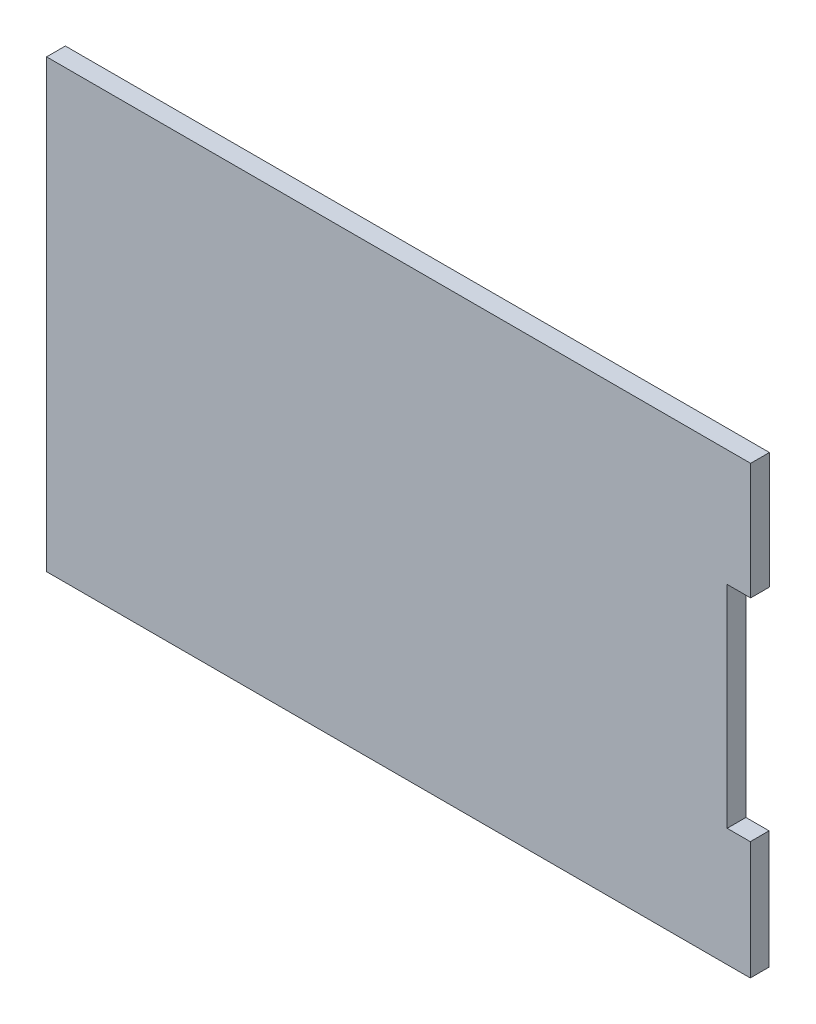
ISO-10303-21;
HEADER;
FILE_DESCRIPTION(('STEP AP214'),'2;1');
FILE_NAME('part.step','',(''),(''),'','','');
FILE_SCHEMA(('AUTOMOTIVE_DESIGN { 1 0 10303 214 1 1 1 1 }'));
ENDSEC;
DATA;
#1=APPLICATION_CONTEXT('core data for automotive mechanical design processes');
#2=APPLICATION_PROTOCOL_DEFINITION('international standard','automotive_design',2000,#1);
#3=PRODUCT_CONTEXT('',#1,'mechanical');
#4=PRODUCT('Part','Part','',(#3));
#5=PRODUCT_RELATED_PRODUCT_CATEGORY('part','',(#4));
#6=PRODUCT_DEFINITION_FORMATION('','',#4);
#7=PRODUCT_DEFINITION_CONTEXT('part definition',#1,'design');
#8=PRODUCT_DEFINITION('design','',#6,#7);
#9=PRODUCT_DEFINITION_SHAPE('','',#8);
#10=(LENGTH_UNIT() NAMED_UNIT(*) SI_UNIT(.MILLI.,.METRE.));
#11=(NAMED_UNIT(*) PLANE_ANGLE_UNIT() SI_UNIT($,.RADIAN.));
#12=(NAMED_UNIT(*) SI_UNIT($,.STERADIAN.) SOLID_ANGLE_UNIT());
#13=UNCERTAINTY_MEASURE_WITH_UNIT(LENGTH_MEASURE(1.E-05),#10,'distance_accuracy_value','');
#14=(GEOMETRIC_REPRESENTATION_CONTEXT(3) GLOBAL_UNCERTAINTY_ASSIGNED_CONTEXT((#13)) GLOBAL_UNIT_ASSIGNED_CONTEXT((#10,
#11,#12)) REPRESENTATION_CONTEXT('',''));
#15=CARTESIAN_POINT('',(0.,0.,0.));
#16=DIRECTION('',(0.,0.,1.));
#17=DIRECTION('',(1.,0.,0.));
#18=AXIS2_PLACEMENT_3D('',#15,#16,#17);
#19=CARTESIAN_POINT('',(0.,0.,0.3));
#20=DIRECTION('',(0.,0.,1.));
#21=DIRECTION('',(1.,0.,0.));
#22=AXIS2_PLACEMENT_3D('',#19,#20,#21);
#23=PLANE('',#22);
#24=DIRECTION('',(0.,1.,0.));
#25=VECTOR('',#24,1.);
#26=CARTESIAN_POINT('',(-28.45,3.00477991377225,0.3));
#27=LINE('',#26,#25);
#28=CARTESIAN_POINT('',(-28.45,-2.99522008622775,0.3));
#29=VERTEX_POINT('',#28);
#30=CARTESIAN_POINT('',(-28.45,3.00477991377225,0.3));
#31=VERTEX_POINT('',#30);
#32=EDGE_CURVE('E241',#29,#31,#27,.T.);
#33=ORIENTED_EDGE('',*,*,#32,.F.);
#34=DIRECTION('',(-1.,0.,0.));
#35=VECTOR('',#34,1.);
#36=CARTESIAN_POINT('',(-22.45,-2.99522008622775,0.3));
#37=LINE('',#36,#35);
#38=CARTESIAN_POINT('',(-22.45,-2.99522008622775,0.3));
#39=VERTEX_POINT('',#38);
#40=EDGE_CURVE('E235',#39,#29,#37,.T.);
#41=ORIENTED_EDGE('',*,*,#40,.F.);
#42=DIRECTION('',(0.,-1.,0.));
#43=VECTOR('',#42,1.);
#44=CARTESIAN_POINT('',(-22.45,3.00477991377225,0.3));
#45=LINE('',#44,#43);
#46=CARTESIAN_POINT('',(-22.45,3.00477991377225,0.3));
#47=VERTEX_POINT('',#46);
#48=EDGE_CURVE('E237',#47,#39,#45,.T.);
#49=ORIENTED_EDGE('',*,*,#48,.F.);
#50=DIRECTION('',(1.,0.,0.));
#51=VECTOR('',#50,1.);
#52=CARTESIAN_POINT('',(-22.45,3.00477991377225,0.3));
#53=LINE('',#52,#51);
#54=EDGE_CURVE('E238',#31,#47,#53,.T.);
#55=ORIENTED_EDGE('',*,*,#54,.F.);
#56=EDGE_LOOP('',(#33,#41,#49,#55));
#57=FACE_BOUND('',#56,.T.);
#58=DIRECTION('',(-1.,0.,0.));
#59=VECTOR('',#58,1.);
#60=CARTESIAN_POINT('',(-36.45,19.0047679580177,0.3));
#61=LINE('',#60,#59);
#62=CARTESIAN_POINT('',(23.55,19.0047679580177,0.3));
#63=VERTEX_POINT('',#62);
#64=CARTESIAN_POINT('',(-36.45,19.0047679580177,0.3));
#65=VERTEX_POINT('',#64);
#66=EDGE_CURVE('E209',#63,#65,#61,.T.);
#67=ORIENTED_EDGE('',*,*,#66,.F.);
#68=DIRECTION('',(0.,1.,0.));
#69=VECTOR('',#68,1.);
#70=CARTESIAN_POINT('',(23.55,9.06833811111835,0.3));
#71=LINE('',#70,#69);
#72=CARTESIAN_POINT('',(23.55,9.06833811111835,0.3));
#73=VERTEX_POINT('',#72);
#74=EDGE_CURVE('E288',#73,#63,#71,.T.);
#75=ORIENTED_EDGE('',*,*,#74,.F.);
#76=DIRECTION('',(1.,0.,0.));
#77=VECTOR('',#76,1.);
#78=CARTESIAN_POINT('',(23.55,9.06833811111835,0.3));
#79=LINE('',#78,#77);
#80=CARTESIAN_POINT('',(21.55,9.06833811111835,0.3));
#81=VERTEX_POINT('',#80);
#82=EDGE_CURVE('E311',#81,#73,#79,.T.);
#83=ORIENTED_EDGE('',*,*,#82,.F.);
#84=DIRECTION('',(0.,1.,0.));
#85=VECTOR('',#84,1.);
#86=CARTESIAN_POINT('',(21.55,9.06833811111835,0.3));
#87=LINE('',#86,#85);
#88=CARTESIAN_POINT('',(21.55,-8.93166188888165,0.3));
#89=VERTEX_POINT('',#88);
#90=EDGE_CURVE('E313',#89,#81,#87,.T.);
#91=ORIENTED_EDGE('',*,*,#90,.F.);
#92=DIRECTION('',(-1.,0.,0.));
#93=VECTOR('',#92,1.);
#94=CARTESIAN_POINT('',(23.5198563903194,-8.93166188888165,0.3));
#95=LINE('',#94,#93);
#96=CARTESIAN_POINT('',(23.5198563903194,-8.93166188888165,0.3));
#97=VERTEX_POINT('',#96);
#98=EDGE_CURVE('E310',#97,#89,#95,.T.);
#99=ORIENTED_EDGE('',*,*,#98,.F.);
#100=DIRECTION('',(0.,1.,0.));
#101=VECTOR('',#100,1.);
#102=CARTESIAN_POINT('',(23.5198563903194,-8.93166188888165,0.3));
#103=LINE('',#102,#101);
#104=CARTESIAN_POINT('',(23.5198563903194,-18.9952200862277,0.3));
#105=VERTEX_POINT('',#104);
#106=EDGE_CURVE('E307',#105,#97,#103,.T.);
#107=ORIENTED_EDGE('',*,*,#106,.F.);
#108=DIRECTION('',(1.,0.,0.));
#109=VECTOR('',#108,1.);
#110=CARTESIAN_POINT('',(-36.45,-18.9952200862277,0.3));
#111=LINE('',#110,#109);
#112=CARTESIAN_POINT('',(-36.45,-18.9952200862277,0.3));
#113=VERTEX_POINT('',#112);
#114=EDGE_CURVE('E302',#113,#105,#111,.T.);
#115=ORIENTED_EDGE('',*,*,#114,.F.);
#116=DIRECTION('',(0.,-1.,0.));
#117=VECTOR('',#116,1.);
#118=CARTESIAN_POINT('',(-36.45,-18.9952200862277,0.3));
#119=LINE('',#118,#117);
#120=EDGE_CURVE('E213',#65,#113,#119,.T.);
#121=ORIENTED_EDGE('',*,*,#120,.F.);
#122=EDGE_LOOP('',(#67,#75,#83,#91,#99,#107,#115,#121));
#123=FACE_BOUND('',#122,.T.);
#124=DIRECTION('',(0.,1.,0.));
#125=VECTOR('',#124,1.);
#126=CARTESIAN_POINT('',(-28.45,-7.49522008622774,0.3));
#127=LINE('',#126,#125);
#128=CARTESIAN_POINT('',(-28.45,-13.4952200862277,0.3));
#129=VERTEX_POINT('',#128);
#130=CARTESIAN_POINT('',(-28.45,-7.49522008622774,0.3));
#131=VERTEX_POINT('',#130);
#132=EDGE_CURVE('E224',#129,#131,#127,.T.);
#133=ORIENTED_EDGE('',*,*,#132,.F.);
#134=DIRECTION('',(-1.,0.,0.));
#135=VECTOR('',#134,1.);
#136=CARTESIAN_POINT('',(-22.45,-13.4952200862277,0.3));
#137=LINE('',#136,#135);
#138=CARTESIAN_POINT('',(-22.45,-13.4952200862277,0.3));
#139=VERTEX_POINT('',#138);
#140=EDGE_CURVE('E266',#139,#129,#137,.T.);
#141=ORIENTED_EDGE('',*,*,#140,.F.);
#142=DIRECTION('',(0.,-1.,0.));
#143=VECTOR('',#142,1.);
#144=CARTESIAN_POINT('',(-22.45,-7.49522008622774,0.3));
#145=LINE('',#144,#143);
#146=CARTESIAN_POINT('',(-22.45,-7.49522008622774,0.3));
#147=VERTEX_POINT('',#146);
#148=EDGE_CURVE('E267',#147,#139,#145,.T.);
#149=ORIENTED_EDGE('',*,*,#148,.F.);
#150=DIRECTION('',(1.,0.,0.));
#151=VECTOR('',#150,1.);
#152=CARTESIAN_POINT('',(-22.45,-7.49522008622774,0.3));
#153=LINE('',#152,#151);
#154=EDGE_CURVE('E272',#131,#147,#153,.T.);
#155=ORIENTED_EDGE('',*,*,#154,.F.);
#156=EDGE_LOOP('',(#133,#141,#149,#155));
#157=FACE_BOUND('',#156,.T.);
#158=DIRECTION('',(0.,1.,0.));
#159=VECTOR('',#158,1.);
#160=CARTESIAN_POINT('',(-28.45,13.5047679580177,0.3));
#161=LINE('',#160,#159);
#162=CARTESIAN_POINT('',(-28.45,7.50476795801769,0.3));
#163=VERTEX_POINT('',#162);
#164=CARTESIAN_POINT('',(-28.45,13.5047679580177,0.3));
#165=VERTEX_POINT('',#164);
#166=EDGE_CURVE('E70',#163,#165,#161,.T.);
#167=ORIENTED_EDGE('',*,*,#166,.F.);
#168=DIRECTION('',(-1.,0.,0.));
#169=VECTOR('',#168,1.);
#170=CARTESIAN_POINT('',(-22.45,7.50476795801769,0.3));
#171=LINE('',#170,#169);
#172=CARTESIAN_POINT('',(-22.45,7.50476795801769,0.3));
#173=VERTEX_POINT('',#172);
#174=EDGE_CURVE('E75',#173,#163,#171,.T.);
#175=ORIENTED_EDGE('',*,*,#174,.F.);
#176=DIRECTION('',(0.,-1.,0.));
#177=VECTOR('',#176,1.);
#178=CARTESIAN_POINT('',(-22.45,13.5047679580177,0.3));
#179=LINE('',#178,#177);
#180=CARTESIAN_POINT('',(-22.45,13.5047679580177,0.3));
#181=VERTEX_POINT('',#180);
#182=EDGE_CURVE('E617',#181,#173,#179,.T.);
#183=ORIENTED_EDGE('',*,*,#182,.F.);
#184=DIRECTION('',(1.,0.,0.));
#185=VECTOR('',#184,1.);
#186=CARTESIAN_POINT('',(-22.45,13.5047679580177,0.3));
#187=LINE('',#186,#185);
#188=EDGE_CURVE('E628',#165,#181,#187,.T.);
#189=ORIENTED_EDGE('',*,*,#188,.F.);
#190=EDGE_LOOP('',(#167,#175,#183,#189));
#191=FACE_BOUND('',#190,.T.);
#192=ADVANCED_FACE('F52',(#57,#123,#157,#191),#23,.F.);
#193=CARTESIAN_POINT('',(-36.45,19.0047679580177,1.9));
#194=DIRECTION('',(0.,-1.,0.));
#195=DIRECTION('',(1.,0.,0.));
#196=AXIS2_PLACEMENT_3D('',#193,#194,#195);
#197=PLANE('',#196);
#198=ORIENTED_EDGE('',*,*,#66,.T.);
#199=DIRECTION('',(0.,0.,-1.));
#200=VECTOR('',#199,1.);
#201=CARTESIAN_POINT('',(-36.45,19.0047679580177,1.9));
#202=LINE('',#201,#200);
#203=CARTESIAN_POINT('',(-36.45,19.0047679580177,1.9));
#204=VERTEX_POINT('',#203);
#205=EDGE_CURVE('E12',#204,#65,#202,.T.);
#206=ORIENTED_EDGE('',*,*,#205,.F.);
#207=DIRECTION('',(-1.,0.,0.));
#208=VECTOR('',#207,1.);
#209=CARTESIAN_POINT('',(-36.45,19.0047679580177,1.9));
#210=LINE('',#209,#208);
#211=CARTESIAN_POINT('',(23.55,19.0047679580177,1.9));
#212=VERTEX_POINT('',#211);
#213=EDGE_CURVE('E282',#212,#204,#210,.T.);
#214=ORIENTED_EDGE('',*,*,#213,.F.);
#215=DIRECTION('',(0.,0.,-1.));
#216=VECTOR('',#215,1.);
#217=CARTESIAN_POINT('',(23.55,19.0047679580177,1.9));
#218=LINE('',#217,#216);
#219=EDGE_CURVE('E301',#212,#63,#218,.T.);
#220=ORIENTED_EDGE('',*,*,#219,.T.);
#221=EDGE_LOOP('',(#198,#206,#214,#220));
#222=FACE_BOUND('',#221,.T.);
#223=ADVANCED_FACE('F54',(#222),#197,.F.);
#224=CARTESIAN_POINT('',(-36.45,-18.9952200862277,1.9));
#225=DIRECTION('',(1.,0.,0.));
#226=DIRECTION('',(0.,1.,0.));
#227=AXIS2_PLACEMENT_3D('',#224,#225,#226);
#228=PLANE('',#227);
#229=ORIENTED_EDGE('',*,*,#120,.T.);
#230=DIRECTION('',(0.,0.,-1.));
#231=VECTOR('',#230,1.);
#232=CARTESIAN_POINT('',(-36.45,-18.9952200862277,1.9));
#233=LINE('',#232,#231);
#234=CARTESIAN_POINT('',(-36.45,-18.9952200862277,1.9));
#235=VERTEX_POINT('',#234);
#236=EDGE_CURVE('E63',#235,#113,#233,.T.);
#237=ORIENTED_EDGE('',*,*,#236,.F.);
#238=DIRECTION('',(0.,-1.,0.));
#239=VECTOR('',#238,1.);
#240=CARTESIAN_POINT('',(-36.45,-18.9952200862277,1.9));
#241=LINE('',#240,#239);
#242=EDGE_CURVE('E290',#204,#235,#241,.T.);
#243=ORIENTED_EDGE('',*,*,#242,.F.);
#244=ORIENTED_EDGE('',*,*,#205,.T.);
#245=EDGE_LOOP('',(#229,#237,#243,#244));
#246=FACE_BOUND('',#245,.T.);
#247=ADVANCED_FACE('F357',(#246),#228,.F.);
#248=CARTESIAN_POINT('',(-36.45,-18.9952200862277,1.9));
#249=DIRECTION('',(0.,1.,0.));
#250=DIRECTION('',(-1.,0.,0.));
#251=AXIS2_PLACEMENT_3D('',#248,#249,#250);
#252=PLANE('',#251);
#253=ORIENTED_EDGE('',*,*,#114,.T.);
#254=DIRECTION('',(0.,0.,-1.));
#255=VECTOR('',#254,1.);
#256=CARTESIAN_POINT('',(23.5198563903194,-18.9952200862277,1.9));
#257=LINE('',#256,#255);
#258=CARTESIAN_POINT('',(23.5198563903194,-18.9952200862277,1.9));
#259=VERTEX_POINT('',#258);
#260=EDGE_CURVE('E329',#259,#105,#257,.T.);
#261=ORIENTED_EDGE('',*,*,#260,.F.);
#262=DIRECTION('',(1.,0.,0.));
#263=VECTOR('',#262,1.);
#264=CARTESIAN_POINT('',(-36.45,-18.9952200862277,1.9));
#265=LINE('',#264,#263);
#266=EDGE_CURVE('E292',#235,#259,#265,.T.);
#267=ORIENTED_EDGE('',*,*,#266,.F.);
#268=ORIENTED_EDGE('',*,*,#236,.T.);
#269=EDGE_LOOP('',(#253,#261,#267,#268));
#270=FACE_BOUND('',#269,.T.);
#271=ADVANCED_FACE('F340',(#270),#252,.F.);
#272=CARTESIAN_POINT('',(23.5198563903194,-8.93166188888165,1.9));
#273=DIRECTION('',(-1.,0.,0.));
#274=DIRECTION('',(0.,-1.,0.));
#275=AXIS2_PLACEMENT_3D('',#272,#273,#274);
#276=PLANE('',#275);
#277=ORIENTED_EDGE('',*,*,#106,.T.);
#278=DIRECTION('',(0.,0.,-1.));
#279=VECTOR('',#278,1.);
#280=CARTESIAN_POINT('',(23.5198563903194,-8.93166188888165,1.9));
#281=LINE('',#280,#279);
#282=CARTESIAN_POINT('',(23.5198563903194,-8.93166188888165,1.9));
#283=VERTEX_POINT('',#282);
#284=EDGE_CURVE('E330',#283,#97,#281,.T.);
#285=ORIENTED_EDGE('',*,*,#284,.F.);
#286=DIRECTION('',(0.,1.,0.));
#287=VECTOR('',#286,1.);
#288=CARTESIAN_POINT('',(23.5198563903194,-8.93166188888165,1.9));
#289=LINE('',#288,#287);
#290=EDGE_CURVE('E291',#259,#283,#289,.T.);
#291=ORIENTED_EDGE('',*,*,#290,.F.);
#292=ORIENTED_EDGE('',*,*,#260,.T.);
#293=EDGE_LOOP('',(#277,#285,#291,#292));
#294=FACE_BOUND('',#293,.T.);
#295=ADVANCED_FACE('F346',(#294),#276,.F.);
#296=CARTESIAN_POINT('',(23.5198563903194,-8.93166188888165,1.9));
#297=DIRECTION('',(0.,-1.,0.));
#298=DIRECTION('',(1.,0.,0.));
#299=AXIS2_PLACEMENT_3D('',#296,#297,#298);
#300=PLANE('',#299);
#301=ORIENTED_EDGE('',*,*,#98,.T.);
#302=DIRECTION('',(0.,0.,-1.));
#303=VECTOR('',#302,1.);
#304=CARTESIAN_POINT('',(21.55,-8.93166188888165,1.9));
#305=LINE('',#304,#303);
#306=CARTESIAN_POINT('',(21.55,-8.93166188888165,1.9));
#307=VERTEX_POINT('',#306);
#308=EDGE_CURVE('E322',#307,#89,#305,.T.);
#309=ORIENTED_EDGE('',*,*,#308,.F.);
#310=DIRECTION('',(-1.,0.,0.));
#311=VECTOR('',#310,1.);
#312=CARTESIAN_POINT('',(23.5198563903194,-8.93166188888165,1.9));
#313=LINE('',#312,#311);
#314=EDGE_CURVE('E293',#283,#307,#313,.T.);
#315=ORIENTED_EDGE('',*,*,#314,.F.);
#316=ORIENTED_EDGE('',*,*,#284,.T.);
#317=EDGE_LOOP('',(#301,#309,#315,#316));
#318=FACE_BOUND('',#317,.T.);
#319=ADVANCED_FACE('F355',(#318),#300,.F.);
#320=CARTESIAN_POINT('',(21.55,9.06833811111835,1.9));
#321=DIRECTION('',(-1.,0.,0.));
#322=DIRECTION('',(0.,-1.,0.));
#323=AXIS2_PLACEMENT_3D('',#320,#321,#322);
#324=PLANE('',#323);
#325=ORIENTED_EDGE('',*,*,#90,.T.);
#326=DIRECTION('',(0.,0.,-1.));
#327=VECTOR('',#326,1.);
#328=CARTESIAN_POINT('',(21.55,9.06833811111835,1.9));
#329=LINE('',#328,#327);
#330=CARTESIAN_POINT('',(21.55,9.06833811111835,1.9));
#331=VERTEX_POINT('',#330);
#332=EDGE_CURVE('E321',#331,#81,#329,.T.);
#333=ORIENTED_EDGE('',*,*,#332,.F.);
#334=DIRECTION('',(0.,1.,0.));
#335=VECTOR('',#334,1.);
#336=CARTESIAN_POINT('',(21.55,9.06833811111835,1.9));
#337=LINE('',#336,#335);
#338=EDGE_CURVE('E300',#307,#331,#337,.T.);
#339=ORIENTED_EDGE('',*,*,#338,.F.);
#340=ORIENTED_EDGE('',*,*,#308,.T.);
#341=EDGE_LOOP('',(#325,#333,#339,#340));
#342=FACE_BOUND('',#341,.T.);
#343=ADVANCED_FACE('F373',(#342),#324,.F.);
#344=CARTESIAN_POINT('',(23.55,9.06833811111835,1.9));
#345=DIRECTION('',(0.,1.,0.));
#346=DIRECTION('',(0.,0.,1.));
#347=AXIS2_PLACEMENT_3D('',#344,#345,#346);
#348=PLANE('',#347);
#349=ORIENTED_EDGE('',*,*,#82,.T.);
#350=DIRECTION('',(0.,0.,-1.));
#351=VECTOR('',#350,1.);
#352=CARTESIAN_POINT('',(23.55,9.06833811111835,1.9));
#353=LINE('',#352,#351);
#354=CARTESIAN_POINT('',(23.55,9.06833811111835,1.9));
#355=VERTEX_POINT('',#354);
#356=EDGE_CURVE('E318',#355,#73,#353,.T.);
#357=ORIENTED_EDGE('',*,*,#356,.F.);
#358=DIRECTION('',(1.,0.,0.));
#359=VECTOR('',#358,1.);
#360=CARTESIAN_POINT('',(23.55,9.06833811111835,1.9));
#361=LINE('',#360,#359);
#362=EDGE_CURVE('E299',#331,#355,#361,.T.);
#363=ORIENTED_EDGE('',*,*,#362,.F.);
#364=ORIENTED_EDGE('',*,*,#332,.T.);
#365=EDGE_LOOP('',(#349,#357,#363,#364));
#366=FACE_BOUND('',#365,.T.);
#367=ADVANCED_FACE('F371',(#366),#348,.F.);
#368=CARTESIAN_POINT('',(23.55,9.06833811111835,1.9));
#369=DIRECTION('',(-1.,0.,0.));
#370=DIRECTION('',(0.,-1.,0.));
#371=AXIS2_PLACEMENT_3D('',#368,#369,#370);
#372=PLANE('',#371);
#373=ORIENTED_EDGE('',*,*,#74,.T.);
#374=ORIENTED_EDGE('',*,*,#219,.F.);
#375=DIRECTION('',(0.,1.,0.));
#376=VECTOR('',#375,1.);
#377=CARTESIAN_POINT('',(23.55,9.06833811111835,1.9));
#378=LINE('',#377,#376);
#379=EDGE_CURVE('E304',#355,#212,#378,.T.);
#380=ORIENTED_EDGE('',*,*,#379,.F.);
#381=ORIENTED_EDGE('',*,*,#356,.T.);
#382=EDGE_LOOP('',(#373,#374,#380,#381));
#383=FACE_BOUND('',#382,.T.);
#384=ADVANCED_FACE('F368',(#383),#372,.F.);
#385=CARTESIAN_POINT('',(0.,0.,1.9));
#386=DIRECTION('',(0.,0.,1.));
#387=DIRECTION('',(1.,0.,0.));
#388=AXIS2_PLACEMENT_3D('',#385,#386,#387);
#389=PLANE('',#388);
#390=ORIENTED_EDGE('',*,*,#213,.T.);
#391=ORIENTED_EDGE('',*,*,#242,.T.);
#392=ORIENTED_EDGE('',*,*,#266,.T.);
#393=ORIENTED_EDGE('',*,*,#290,.T.);
#394=ORIENTED_EDGE('',*,*,#314,.T.);
#395=ORIENTED_EDGE('',*,*,#338,.T.);
#396=ORIENTED_EDGE('',*,*,#362,.T.);
#397=ORIENTED_EDGE('',*,*,#379,.T.);
#398=EDGE_LOOP('',(#390,#391,#392,#393,#394,#395,#396,#397));
#399=FACE_BOUND('',#398,.T.);
#400=ADVANCED_FACE('F359',(#399),#389,.T.);
#401=CARTESIAN_POINT('',(-28.45,-7.49522008622774,-4.7));
#402=DIRECTION('',(1.,0.,0.));
#403=DIRECTION('',(0.,0.,-1.));
#404=AXIS2_PLACEMENT_3D('',#401,#402,#403);
#405=PLANE('',#404);
#406=ORIENTED_EDGE('',*,*,#132,.T.);
#407=DIRECTION('',(0.,0.,1.));
#408=VECTOR('',#407,1.);
#409=CARTESIAN_POINT('',(-28.45,-7.49522008622774,-4.7));
#410=LINE('',#409,#408);
#411=CARTESIAN_POINT('',(-28.45,-7.49522008622774,-4.7));
#412=VERTEX_POINT('',#411);
#413=EDGE_CURVE('E251',#412,#131,#410,.T.);
#414=ORIENTED_EDGE('',*,*,#413,.F.);
#415=DIRECTION('',(0.,1.,0.));
#416=VECTOR('',#415,1.);
#417=CARTESIAN_POINT('',(-28.45,-7.49522008622774,-4.7));
#418=LINE('',#417,#416);
#419=CARTESIAN_POINT('',(-28.45,-13.4952200862277,-4.7));
#420=VERTEX_POINT('',#419);
#421=EDGE_CURVE('E269',#420,#412,#418,.T.);
#422=ORIENTED_EDGE('',*,*,#421,.F.);
#423=DIRECTION('',(0.,0.,1.));
#424=VECTOR('',#423,1.);
#425=CARTESIAN_POINT('',(-28.45,-13.4952200862277,-4.7));
#426=LINE('',#425,#424);
#427=EDGE_CURVE('E265',#420,#129,#426,.T.);
#428=ORIENTED_EDGE('',*,*,#427,.T.);
#429=EDGE_LOOP('',(#406,#414,#422,#428));
#430=FACE_BOUND('',#429,.T.);
#431=ADVANCED_FACE('F399',(#430),#405,.F.);
#432=CARTESIAN_POINT('',(-22.45,-7.49522008622774,-4.7));
#433=DIRECTION('',(0.,-1.,0.));
#434=DIRECTION('',(1.,0.,0.));
#435=AXIS2_PLACEMENT_3D('',#432,#433,#434);
#436=PLANE('',#435);
#437=ORIENTED_EDGE('',*,*,#154,.T.);
#438=DIRECTION('',(0.,0.,1.));
#439=VECTOR('',#438,1.);
#440=CARTESIAN_POINT('',(-22.45,-7.49522008622774,-4.7));
#441=LINE('',#440,#439);
#442=CARTESIAN_POINT('',(-22.45,-7.49522008622774,-4.7));
#443=VERTEX_POINT('',#442);
#444=EDGE_CURVE('E258',#443,#147,#441,.T.);
#445=ORIENTED_EDGE('',*,*,#444,.F.);
#446=DIRECTION('',(1.,0.,0.));
#447=VECTOR('',#446,1.);
#448=CARTESIAN_POINT('',(-22.45,-7.49522008622774,-4.7));
#449=LINE('',#448,#447);
#450=EDGE_CURVE('E283',#412,#443,#449,.T.);
#451=ORIENTED_EDGE('',*,*,#450,.F.);
#452=ORIENTED_EDGE('',*,*,#413,.T.);
#453=EDGE_LOOP('',(#437,#445,#451,#452));
#454=FACE_BOUND('',#453,.T.);
#455=ADVANCED_FACE('F398',(#454),#436,.F.);
#456=CARTESIAN_POINT('',(-22.45,-7.49522008622774,-4.7));
#457=DIRECTION('',(-1.,0.,0.));
#458=DIRECTION('',(0.,0.,1.));
#459=AXIS2_PLACEMENT_3D('',#456,#457,#458);
#460=PLANE('',#459);
#461=ORIENTED_EDGE('',*,*,#148,.T.);
#462=DIRECTION('',(0.,0.,1.));
#463=VECTOR('',#462,1.);
#464=CARTESIAN_POINT('',(-22.45,-13.4952200862277,-4.7));
#465=LINE('',#464,#463);
#466=CARTESIAN_POINT('',(-22.45,-13.4952200862277,-4.7));
#467=VERTEX_POINT('',#466);
#468=EDGE_CURVE('E259',#467,#139,#465,.T.);
#469=ORIENTED_EDGE('',*,*,#468,.F.);
#470=DIRECTION('',(0.,-1.,0.));
#471=VECTOR('',#470,1.);
#472=CARTESIAN_POINT('',(-22.45,-7.49522008622774,-4.7));
#473=LINE('',#472,#471);
#474=EDGE_CURVE('E276',#443,#467,#473,.T.);
#475=ORIENTED_EDGE('',*,*,#474,.F.);
#476=ORIENTED_EDGE('',*,*,#444,.T.);
#477=EDGE_LOOP('',(#461,#469,#475,#476));
#478=FACE_BOUND('',#477,.T.);
#479=ADVANCED_FACE('F403',(#478),#460,.F.);
#480=CARTESIAN_POINT('',(-22.45,-13.4952200862277,-4.7));
#481=DIRECTION('',(0.,1.,0.));
#482=DIRECTION('',(0.,0.,1.));
#483=AXIS2_PLACEMENT_3D('',#480,#481,#482);
#484=PLANE('',#483);
#485=ORIENTED_EDGE('',*,*,#140,.T.);
#486=ORIENTED_EDGE('',*,*,#427,.F.);
#487=DIRECTION('',(-1.,0.,0.));
#488=VECTOR('',#487,1.);
#489=CARTESIAN_POINT('',(-22.45,-13.4952200862277,-4.7));
#490=LINE('',#489,#488);
#491=EDGE_CURVE('E264',#467,#420,#490,.T.);
#492=ORIENTED_EDGE('',*,*,#491,.F.);
#493=ORIENTED_EDGE('',*,*,#468,.T.);
#494=EDGE_LOOP('',(#485,#486,#492,#493));
#495=FACE_BOUND('',#494,.T.);
#496=ADVANCED_FACE('F413',(#495),#484,.F.);
#497=CARTESIAN_POINT('',(0.,0.,-4.7));
#498=DIRECTION('',(0.,0.,-1.));
#499=DIRECTION('',(-1.,0.,0.));
#500=AXIS2_PLACEMENT_3D('',#497,#498,#499);
#501=PLANE('',#500);
#502=ORIENTED_EDGE('',*,*,#421,.T.);
#503=ORIENTED_EDGE('',*,*,#450,.T.);
#504=ORIENTED_EDGE('',*,*,#474,.T.);
#505=ORIENTED_EDGE('',*,*,#491,.T.);
#506=EDGE_LOOP('',(#502,#503,#504,#505));
#507=FACE_BOUND('',#506,.T.);
#508=ADVANCED_FACE('F417',(#507),#501,.T.);
#509=CARTESIAN_POINT('',(-28.45,3.00477991377225,-4.7));
#510=DIRECTION('',(1.,0.,0.));
#511=DIRECTION('',(0.,0.,-1.));
#512=AXIS2_PLACEMENT_3D('',#509,#510,#511);
#513=PLANE('',#512);
#514=ORIENTED_EDGE('',*,*,#32,.T.);
#515=DIRECTION('',(0.,0.,1.));
#516=VECTOR('',#515,1.);
#517=CARTESIAN_POINT('',(-28.45,3.00477991377225,-4.7));
#518=LINE('',#517,#516);
#519=CARTESIAN_POINT('',(-28.45,3.00477991377225,-4.7));
#520=VERTEX_POINT('',#519);
#521=EDGE_CURVE('E218',#520,#31,#518,.T.);
#522=ORIENTED_EDGE('',*,*,#521,.F.);
#523=DIRECTION('',(0.,1.,0.));
#524=VECTOR('',#523,1.);
#525=CARTESIAN_POINT('',(-28.45,3.00477991377225,-4.7));
#526=LINE('',#525,#524);
#527=CARTESIAN_POINT('',(-28.45,-2.99522008622775,-4.7));
#528=VERTEX_POINT('',#527);
#529=EDGE_CURVE('E240',#528,#520,#526,.T.);
#530=ORIENTED_EDGE('',*,*,#529,.F.);
#531=DIRECTION('',(0.,0.,1.));
#532=VECTOR('',#531,1.);
#533=CARTESIAN_POINT('',(-28.45,-2.99522008622775,-4.7));
#534=LINE('',#533,#532);
#535=EDGE_CURVE('E229',#528,#29,#534,.T.);
#536=ORIENTED_EDGE('',*,*,#535,.T.);
#537=EDGE_LOOP('',(#514,#522,#530,#536));
#538=FACE_BOUND('',#537,.T.);
#539=ADVANCED_FACE('F419',(#538),#513,.F.);
#540=CARTESIAN_POINT('',(-22.45,3.00477991377225,-4.7));
#541=DIRECTION('',(0.,-1.,0.));
#542=DIRECTION('',(0.,0.,-1.));
#543=AXIS2_PLACEMENT_3D('',#540,#541,#542);
#544=PLANE('',#543);
#545=ORIENTED_EDGE('',*,*,#54,.T.);
#546=DIRECTION('',(0.,0.,1.));
#547=VECTOR('',#546,1.);
#548=CARTESIAN_POINT('',(-22.45,3.00477991377225,-4.7));
#549=LINE('',#548,#547);
#550=CARTESIAN_POINT('',(-22.45,3.00477991377225,-4.7));
#551=VERTEX_POINT('',#550);
#552=EDGE_CURVE('E225',#551,#47,#549,.T.);
#553=ORIENTED_EDGE('',*,*,#552,.F.);
#554=DIRECTION('',(1.,0.,0.));
#555=VECTOR('',#554,1.);
#556=CARTESIAN_POINT('',(-22.45,3.00477991377225,-4.7));
#557=LINE('',#556,#555);
#558=EDGE_CURVE('E248',#520,#551,#557,.T.);
#559=ORIENTED_EDGE('',*,*,#558,.F.);
#560=ORIENTED_EDGE('',*,*,#521,.T.);
#561=EDGE_LOOP('',(#545,#553,#559,#560));
#562=FACE_BOUND('',#561,.T.);
#563=ADVANCED_FACE('F422',(#562),#544,.F.);
#564=CARTESIAN_POINT('',(-22.45,3.00477991377225,-4.7));
#565=DIRECTION('',(-1.,0.,0.));
#566=DIRECTION('',(0.,0.,1.));
#567=AXIS2_PLACEMENT_3D('',#564,#565,#566);
#568=PLANE('',#567);
#569=ORIENTED_EDGE('',*,*,#48,.T.);
#570=DIRECTION('',(0.,0.,1.));
#571=VECTOR('',#570,1.);
#572=CARTESIAN_POINT('',(-22.45,-2.99522008622775,-4.7));
#573=LINE('',#572,#571);
#574=CARTESIAN_POINT('',(-22.45,-2.99522008622775,-4.7));
#575=VERTEX_POINT('',#574);
#576=EDGE_CURVE('E228',#575,#39,#573,.T.);
#577=ORIENTED_EDGE('',*,*,#576,.F.);
#578=DIRECTION('',(0.,-1.,0.));
#579=VECTOR('',#578,1.);
#580=CARTESIAN_POINT('',(-22.45,3.00477991377225,-4.7));
#581=LINE('',#580,#579);
#582=EDGE_CURVE('E246',#551,#575,#581,.T.);
#583=ORIENTED_EDGE('',*,*,#582,.F.);
#584=ORIENTED_EDGE('',*,*,#552,.T.);
#585=EDGE_LOOP('',(#569,#577,#583,#584));
#586=FACE_BOUND('',#585,.T.);
#587=ADVANCED_FACE('F437',(#586),#568,.F.);
#588=CARTESIAN_POINT('',(-22.45,-2.99522008622775,-4.7));
#589=DIRECTION('',(0.,1.,0.));
#590=DIRECTION('',(0.,0.,1.));
#591=AXIS2_PLACEMENT_3D('',#588,#589,#590);
#592=PLANE('',#591);
#593=ORIENTED_EDGE('',*,*,#40,.T.);
#594=ORIENTED_EDGE('',*,*,#535,.F.);
#595=DIRECTION('',(-1.,0.,0.));
#596=VECTOR('',#595,1.);
#597=CARTESIAN_POINT('',(-22.45,-2.99522008622775,-4.7));
#598=LINE('',#597,#596);
#599=EDGE_CURVE('E231',#575,#528,#598,.T.);
#600=ORIENTED_EDGE('',*,*,#599,.F.);
#601=ORIENTED_EDGE('',*,*,#576,.T.);
#602=EDGE_LOOP('',(#593,#594,#600,#601));
#603=FACE_BOUND('',#602,.T.);
#604=ADVANCED_FACE('F443',(#603),#592,.F.);
#605=CARTESIAN_POINT('',(0.,0.,-4.7));
#606=DIRECTION('',(0.,0.,-1.));
#607=DIRECTION('',(-1.,0.,0.));
#608=AXIS2_PLACEMENT_3D('',#605,#606,#607);
#609=PLANE('',#608);
#610=ORIENTED_EDGE('',*,*,#529,.T.);
#611=ORIENTED_EDGE('',*,*,#558,.T.);
#612=ORIENTED_EDGE('',*,*,#582,.T.);
#613=ORIENTED_EDGE('',*,*,#599,.T.);
#614=EDGE_LOOP('',(#610,#611,#612,#613));
#615=FACE_BOUND('',#614,.T.);
#616=ADVANCED_FACE('F409',(#615),#609,.T.);
#617=CARTESIAN_POINT('',(-28.45,13.5047679580177,-4.7));
#618=DIRECTION('',(1.,0.,0.));
#619=DIRECTION('',(0.,0.,-1.));
#620=AXIS2_PLACEMENT_3D('',#617,#618,#619);
#621=PLANE('',#620);
#622=ORIENTED_EDGE('',*,*,#166,.T.);
#623=DIRECTION('',(0.,0.,1.));
#624=VECTOR('',#623,1.);
#625=CARTESIAN_POINT('',(-28.45,13.5047679580177,-4.7));
#626=LINE('',#625,#624);
#627=CARTESIAN_POINT('',(-28.45,13.5047679580177,-4.7));
#628=VERTEX_POINT('',#627);
#629=EDGE_CURVE('E195',#628,#165,#626,.T.);
#630=ORIENTED_EDGE('',*,*,#629,.F.);
#631=DIRECTION('',(0.,1.,0.));
#632=VECTOR('',#631,1.);
#633=CARTESIAN_POINT('',(-28.45,13.5047679580177,-4.7));
#634=LINE('',#633,#632);
#635=CARTESIAN_POINT('',(-28.45,7.50476795801769,-4.7));
#636=VERTEX_POINT('',#635);
#637=EDGE_CURVE('E200',#636,#628,#634,.T.);
#638=ORIENTED_EDGE('',*,*,#637,.F.);
#639=DIRECTION('',(0.,0.,1.));
#640=VECTOR('',#639,1.);
#641=CARTESIAN_POINT('',(-28.45,7.50476795801769,-4.7));
#642=LINE('',#641,#640);
#643=EDGE_CURVE('E620',#636,#163,#642,.T.);
#644=ORIENTED_EDGE('',*,*,#643,.T.);
#645=EDGE_LOOP('',(#622,#630,#638,#644));
#646=FACE_BOUND('',#645,.T.);
#647=ADVANCED_FACE('F207',(#646),#621,.F.);
#648=CARTESIAN_POINT('',(-22.45,13.5047679580177,-4.7));
#649=DIRECTION('',(0.,-1.,0.));
#650=DIRECTION('',(0.,0.,-1.));
#651=AXIS2_PLACEMENT_3D('',#648,#649,#650);
#652=PLANE('',#651);
#653=ORIENTED_EDGE('',*,*,#188,.T.);
#654=DIRECTION('',(0.,0.,1.));
#655=VECTOR('',#654,1.);
#656=CARTESIAN_POINT('',(-22.45,13.5047679580177,-4.7));
#657=LINE('',#656,#655);
#658=CARTESIAN_POINT('',(-22.45,13.5047679580177,-4.7));
#659=VERTEX_POINT('',#658);
#660=EDGE_CURVE('E192',#659,#181,#657,.T.);
#661=ORIENTED_EDGE('',*,*,#660,.F.);
#662=DIRECTION('',(1.,0.,0.));
#663=VECTOR('',#662,1.);
#664=CARTESIAN_POINT('',(-22.45,13.5047679580177,-4.7));
#665=LINE('',#664,#663);
#666=EDGE_CURVE('E186',#628,#659,#665,.T.);
#667=ORIENTED_EDGE('',*,*,#666,.F.);
#668=ORIENTED_EDGE('',*,*,#629,.T.);
#669=EDGE_LOOP('',(#653,#661,#667,#668));
#670=FACE_BOUND('',#669,.T.);
#671=ADVANCED_FACE('F194',(#670),#652,.F.);
#672=CARTESIAN_POINT('',(-22.45,13.5047679580177,-4.7));
#673=DIRECTION('',(-1.,0.,0.));
#674=DIRECTION('',(0.,0.,1.));
#675=AXIS2_PLACEMENT_3D('',#672,#673,#674);
#676=PLANE('',#675);
#677=ORIENTED_EDGE('',*,*,#182,.T.);
#678=DIRECTION('',(0.,0.,1.));
#679=VECTOR('',#678,1.);
#680=CARTESIAN_POINT('',(-22.45,7.50476795801769,-4.7));
#681=LINE('',#680,#679);
#682=CARTESIAN_POINT('',(-22.45,7.50476795801769,-4.7));
#683=VERTEX_POINT('',#682);
#684=EDGE_CURVE('E214',#683,#173,#681,.T.);
#685=ORIENTED_EDGE('',*,*,#684,.F.);
#686=DIRECTION('',(0.,-1.,0.));
#687=VECTOR('',#686,1.);
#688=CARTESIAN_POINT('',(-22.45,13.5047679580177,-4.7));
#689=LINE('',#688,#687);
#690=EDGE_CURVE('E196',#659,#683,#689,.T.);
#691=ORIENTED_EDGE('',*,*,#690,.F.);
#692=ORIENTED_EDGE('',*,*,#660,.T.);
#693=EDGE_LOOP('',(#677,#685,#691,#692));
#694=FACE_BOUND('',#693,.T.);
#695=ADVANCED_FACE('F469',(#694),#676,.F.);
#696=CARTESIAN_POINT('',(-22.45,7.50476795801769,-4.7));
#697=DIRECTION('',(0.,1.,0.));
#698=DIRECTION('',(-1.,0.,0.));
#699=AXIS2_PLACEMENT_3D('',#696,#697,#698);
#700=PLANE('',#699);
#701=ORIENTED_EDGE('',*,*,#174,.T.);
#702=ORIENTED_EDGE('',*,*,#643,.F.);
#703=DIRECTION('',(-1.,0.,0.));
#704=VECTOR('',#703,1.);
#705=CARTESIAN_POINT('',(-22.45,7.50476795801769,-4.7));
#706=LINE('',#705,#704);
#707=EDGE_CURVE('E204',#683,#636,#706,.T.);
#708=ORIENTED_EDGE('',*,*,#707,.F.);
#709=ORIENTED_EDGE('',*,*,#684,.T.);
#710=EDGE_LOOP('',(#701,#702,#708,#709));
#711=FACE_BOUND('',#710,.T.);
#712=ADVANCED_FACE('F467',(#711),#700,.F.);
#713=CARTESIAN_POINT('',(0.,0.,-4.7));
#714=DIRECTION('',(0.,0.,-1.));
#715=DIRECTION('',(-1.,0.,0.));
#716=AXIS2_PLACEMENT_3D('',#713,#714,#715);
#717=PLANE('',#716);
#718=ORIENTED_EDGE('',*,*,#637,.T.);
#719=ORIENTED_EDGE('',*,*,#666,.T.);
#720=ORIENTED_EDGE('',*,*,#690,.T.);
#721=ORIENTED_EDGE('',*,*,#707,.T.);
#722=EDGE_LOOP('',(#718,#719,#720,#721));
#723=FACE_BOUND('',#722,.T.);
#724=ADVANCED_FACE('F205',(#723),#717,.T.);
#725=CLOSED_SHELL('',(#192,#223,#247,#271,#295,#319,#343,#367,#384,#400,#431,#455,#479,#496,
#508,#539,#563,#587,#604,#616,#647,#671,#695,#712,#724));
#726=MANIFOLD_SOLID_BREP('B2',#725);
#727=CARTESIAN_POINT('',(19.55,12.7,0.3));
#728=DIRECTION('',(-1.,0.,0.));
#729=DIRECTION('',(0.,-1.,0.));
#730=AXIS2_PLACEMENT_3D('',#727,#728,#729);
#731=PLANE('',#730);
#732=DIRECTION('',(0.,1.,0.));
#733=VECTOR('',#732,1.);
#734=CARTESIAN_POINT('',(19.55,12.7,0.));
#735=LINE('',#734,#733);
#736=CARTESIAN_POINT('',(19.55,-12.7,0.));
#737=VERTEX_POINT('',#736);
#738=CARTESIAN_POINT('',(19.55,12.7,0.));
#739=VERTEX_POINT('',#738);
#740=EDGE_CURVE('E695',#737,#739,#735,.T.);
#741=ORIENTED_EDGE('',*,*,#740,.T.);
#742=DIRECTION('',(0.,0.,-1.));
#743=VECTOR('',#742,1.);
#744=CARTESIAN_POINT('',(19.55,12.7,0.3));
#745=LINE('',#744,#743);
#746=CARTESIAN_POINT('',(19.55,12.7,0.3));
#747=VERTEX_POINT('',#746);
#748=EDGE_CURVE('E51',#747,#739,#745,.T.);
#749=ORIENTED_EDGE('',*,*,#748,.F.);
#750=DIRECTION('',(0.,1.,0.));
#751=VECTOR('',#750,1.);
#752=CARTESIAN_POINT('',(19.55,12.7,0.3));
#753=LINE('',#752,#751);
#754=CARTESIAN_POINT('',(19.55,-12.7,0.3));
#755=VERTEX_POINT('',#754);
#756=EDGE_CURVE('E685',#755,#747,#753,.T.);
#757=ORIENTED_EDGE('',*,*,#756,.F.);
#758=DIRECTION('',(0.,0.,-1.));
#759=VECTOR('',#758,1.);
#760=CARTESIAN_POINT('',(19.55,-12.7,0.3));
#761=LINE('',#760,#759);
#762=EDGE_CURVE('E687',#755,#737,#761,.T.);
#763=ORIENTED_EDGE('',*,*,#762,.T.);
#764=EDGE_LOOP('',(#741,#749,#757,#763));
#765=FACE_BOUND('',#764,.T.);
#766=ADVANCED_FACE('F634',(#765),#731,.F.);
#767=CARTESIAN_POINT('',(-19.55,12.7,0.3));
#768=DIRECTION('',(0.,-1.,0.));
#769=DIRECTION('',(0.,0.,-1.));
#770=AXIS2_PLACEMENT_3D('',#767,#768,#769);
#771=PLANE('',#770);
#772=DIRECTION('',(-1.,0.,0.));
#773=VECTOR('',#772,1.);
#774=CARTESIAN_POINT('',(-19.55,12.7,0.));
#775=LINE('',#774,#773);
#776=CARTESIAN_POINT('',(-19.55,12.7,0.));
#777=VERTEX_POINT('',#776);
#778=EDGE_CURVE('E689',#739,#777,#775,.T.);
#779=ORIENTED_EDGE('',*,*,#778,.T.);
#780=DIRECTION('',(0.,0.,-1.));
#781=VECTOR('',#780,1.);
#782=CARTESIAN_POINT('',(-19.55,12.7,0.3));
#783=LINE('',#782,#781);
#784=CARTESIAN_POINT('',(-19.55,12.7,0.3));
#785=VERTEX_POINT('',#784);
#786=EDGE_CURVE('E640',#785,#777,#783,.T.);
#787=ORIENTED_EDGE('',*,*,#786,.F.);
#788=DIRECTION('',(-1.,0.,0.));
#789=VECTOR('',#788,1.);
#790=CARTESIAN_POINT('',(-19.55,12.7,0.3));
#791=LINE('',#790,#789);
#792=EDGE_CURVE('E680',#747,#785,#791,.T.);
#793=ORIENTED_EDGE('',*,*,#792,.F.);
#794=ORIENTED_EDGE('',*,*,#748,.T.);
#795=EDGE_LOOP('',(#779,#787,#793,#794));
#796=FACE_BOUND('',#795,.T.);
#797=ADVANCED_FACE('F682',(#796),#771,.F.);
#798=CARTESIAN_POINT('',(-19.55,12.7,0.3));
#799=DIRECTION('',(1.,0.,0.));
#800=DIRECTION('',(0.,1.,0.));
#801=AXIS2_PLACEMENT_3D('',#798,#799,#800);
#802=PLANE('',#801);
#803=DIRECTION('',(0.,-1.,0.));
#804=VECTOR('',#803,1.);
#805=CARTESIAN_POINT('',(-19.55,12.7,0.));
#806=LINE('',#805,#804);
#807=CARTESIAN_POINT('',(-19.55,-12.7,0.));
#808=VERTEX_POINT('',#807);
#809=EDGE_CURVE('E661',#777,#808,#806,.T.);
#810=ORIENTED_EDGE('',*,*,#809,.T.);
#811=DIRECTION('',(0.,0.,-1.));
#812=VECTOR('',#811,1.);
#813=CARTESIAN_POINT('',(-19.55,-12.7,0.3));
#814=LINE('',#813,#812);
#815=CARTESIAN_POINT('',(-19.55,-12.7,0.3));
#816=VERTEX_POINT('',#815);
#817=EDGE_CURVE('E686',#816,#808,#814,.T.);
#818=ORIENTED_EDGE('',*,*,#817,.F.);
#819=DIRECTION('',(0.,-1.,0.));
#820=VECTOR('',#819,1.);
#821=CARTESIAN_POINT('',(-19.55,12.7,0.3));
#822=LINE('',#821,#820);
#823=EDGE_CURVE('E678',#785,#816,#822,.T.);
#824=ORIENTED_EDGE('',*,*,#823,.F.);
#825=ORIENTED_EDGE('',*,*,#786,.T.);
#826=EDGE_LOOP('',(#810,#818,#824,#825));
#827=FACE_BOUND('',#826,.T.);
#828=ADVANCED_FACE('F690',(#827),#802,.F.);
#829=CARTESIAN_POINT('',(-19.55,-12.7,0.3));
#830=DIRECTION('',(0.,1.,0.));
#831=DIRECTION('',(0.,0.,1.));
#832=AXIS2_PLACEMENT_3D('',#829,#830,#831);
#833=PLANE('',#832);
#834=DIRECTION('',(1.,0.,0.));
#835=VECTOR('',#834,1.);
#836=CARTESIAN_POINT('',(-19.55,-12.7,0.));
#837=LINE('',#836,#835);
#838=EDGE_CURVE('E667',#808,#737,#837,.T.);
#839=ORIENTED_EDGE('',*,*,#838,.T.);
#840=ORIENTED_EDGE('',*,*,#762,.F.);
#841=DIRECTION('',(1.,0.,0.));
#842=VECTOR('',#841,1.);
#843=CARTESIAN_POINT('',(-19.55,-12.7,0.3));
#844=LINE('',#843,#842);
#845=EDGE_CURVE('E650',#816,#755,#844,.T.);
#846=ORIENTED_EDGE('',*,*,#845,.F.);
#847=ORIENTED_EDGE('',*,*,#817,.T.);
#848=EDGE_LOOP('',(#839,#840,#846,#847));
#849=FACE_BOUND('',#848,.T.);
#850=ADVANCED_FACE('F701',(#849),#833,.F.);
#851=CARTESIAN_POINT('',(0.,0.,0.3));
#852=DIRECTION('',(0.,0.,1.));
#853=DIRECTION('',(1.,0.,0.));
#854=AXIS2_PLACEMENT_3D('',#851,#852,#853);
#855=PLANE('',#854);
#856=ORIENTED_EDGE('',*,*,#756,.T.);
#857=ORIENTED_EDGE('',*,*,#792,.T.);
#858=ORIENTED_EDGE('',*,*,#823,.T.);
#859=ORIENTED_EDGE('',*,*,#845,.T.);
#860=EDGE_LOOP('',(#856,#857,#858,#859));
#861=FACE_BOUND('',#860,.T.);
#862=ADVANCED_FACE('F676',(#861),#855,.T.);
#863=CARTESIAN_POINT('',(0.,0.,0.));
#864=DIRECTION('',(0.,0.,1.));
#865=DIRECTION('',(1.,0.,0.));
#866=AXIS2_PLACEMENT_3D('',#863,#864,#865);
#867=PLANE('',#866);
#868=ORIENTED_EDGE('',*,*,#740,.F.);
#869=ORIENTED_EDGE('',*,*,#838,.F.);
#870=ORIENTED_EDGE('',*,*,#809,.F.);
#871=ORIENTED_EDGE('',*,*,#778,.F.);
#872=EDGE_LOOP('',(#868,#869,#870,#871));
#873=FACE_BOUND('',#872,.T.);
#874=ADVANCED_FACE('F702',(#873),#867,.F.);
#875=CLOSED_SHELL('',(#766,#797,#828,#850,#862,#874));
#876=MANIFOLD_SOLID_BREP('B6',#875);
#877=ADVANCED_BREP_SHAPE_REPRESENTATION('',(#18,#726,#876),#14);
#878=SHAPE_DEFINITION_REPRESENTATION(#9,#877);
ENDSEC;
END-ISO-10303-21;
